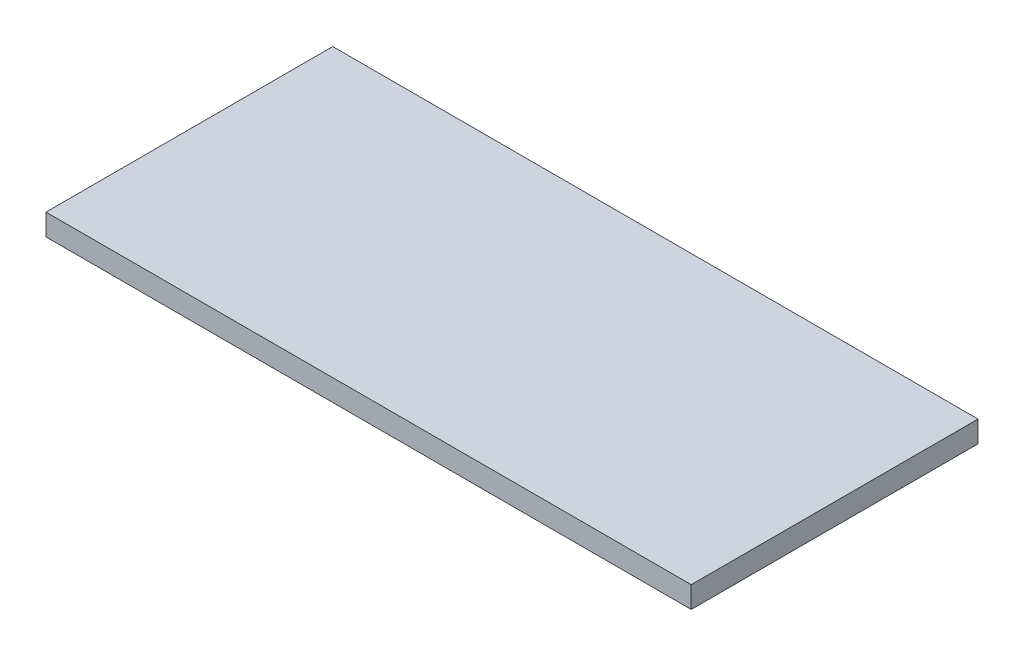
ISO-10303-21;
HEADER;
FILE_DESCRIPTION(('STEP AP214'),'2;1');
FILE_NAME('part.step','',(''),(''),'','','');
FILE_SCHEMA(('AUTOMOTIVE_DESIGN { 1 0 10303 214 1 1 1 1 }'));
ENDSEC;
DATA;
#1=APPLICATION_CONTEXT('core data for automotive mechanical design processes');
#2=APPLICATION_PROTOCOL_DEFINITION('international standard','automotive_design',2000,#1);
#3=PRODUCT_CONTEXT('',#1,'mechanical');
#4=PRODUCT('Part','Part','',(#3));
#5=PRODUCT_RELATED_PRODUCT_CATEGORY('part','',(#4));
#6=PRODUCT_DEFINITION_FORMATION('','',#4);
#7=PRODUCT_DEFINITION_CONTEXT('part definition',#1,'design');
#8=PRODUCT_DEFINITION('design','',#6,#7);
#9=PRODUCT_DEFINITION_SHAPE('','',#8);
#10=(LENGTH_UNIT() NAMED_UNIT(*) SI_UNIT(.MILLI.,.METRE.));
#11=(NAMED_UNIT(*) PLANE_ANGLE_UNIT() SI_UNIT($,.RADIAN.));
#12=(NAMED_UNIT(*) SI_UNIT($,.STERADIAN.) SOLID_ANGLE_UNIT());
#13=UNCERTAINTY_MEASURE_WITH_UNIT(LENGTH_MEASURE(1.E-05),#10,'distance_accuracy_value','');
#14=(GEOMETRIC_REPRESENTATION_CONTEXT(3) GLOBAL_UNCERTAINTY_ASSIGNED_CONTEXT((#13)) GLOBAL_UNIT_ASSIGNED_CONTEXT((#10,
#11,#12)) REPRESENTATION_CONTEXT('',''));
#15=CARTESIAN_POINT('',(0.,0.,0.));
#16=DIRECTION('',(0.,0.,1.));
#17=DIRECTION('',(1.,0.,0.));
#18=AXIS2_PLACEMENT_3D('',#15,#16,#17);
#19=CARTESIAN_POINT('',(225.,15.,100.));
#20=DIRECTION('',(-1.,0.,0.));
#21=DIRECTION('',(0.,0.,1.));
#22=AXIS2_PLACEMENT_3D('',#19,#20,#21);
#23=PLANE('',#22);
#24=DIRECTION('',(0.,0.,-1.));
#25=VECTOR('',#24,1.);
#26=CARTESIAN_POINT('',(225.,0.,100.));
#27=LINE('',#26,#25);
#28=CARTESIAN_POINT('',(225.,0.,100.));
#29=VERTEX_POINT('',#28);
#30=CARTESIAN_POINT('',(225.,0.,-100.));
#31=VERTEX_POINT('',#30);
#32=EDGE_CURVE('E96',#29,#31,#27,.T.);
#33=ORIENTED_EDGE('',*,*,#32,.T.);
#34=DIRECTION('',(0.,-1.,0.));
#35=VECTOR('',#34,1.);
#36=CARTESIAN_POINT('',(225.,15.,-100.));
#37=LINE('',#36,#35);
#38=CARTESIAN_POINT('',(225.,15.,-100.));
#39=VERTEX_POINT('',#38);
#40=EDGE_CURVE('E11',#39,#31,#37,.T.);
#41=ORIENTED_EDGE('',*,*,#40,.F.);
#42=DIRECTION('',(0.,0.,-1.));
#43=VECTOR('',#42,1.);
#44=CARTESIAN_POINT('',(225.,15.,100.));
#45=LINE('',#44,#43);
#46=CARTESIAN_POINT('',(225.,15.,100.));
#47=VERTEX_POINT('',#46);
#48=EDGE_CURVE('E84',#47,#39,#45,.T.);
#49=ORIENTED_EDGE('',*,*,#48,.F.);
#50=DIRECTION('',(0.,-1.,0.));
#51=VECTOR('',#50,1.);
#52=CARTESIAN_POINT('',(225.,15.,100.));
#53=LINE('',#52,#51);
#54=EDGE_CURVE('E92',#47,#29,#53,.T.);
#55=ORIENTED_EDGE('',*,*,#54,.T.);
#56=EDGE_LOOP('',(#33,#41,#49,#55));
#57=FACE_BOUND('',#56,.T.);
#58=ADVANCED_FACE('F33',(#57),#23,.F.);
#59=CARTESIAN_POINT('',(-225.,15.,-100.));
#60=DIRECTION('',(0.,0.,1.));
#61=DIRECTION('',(1.,0.,0.));
#62=AXIS2_PLACEMENT_3D('',#59,#60,#61);
#63=PLANE('',#62);
#64=DIRECTION('',(-1.,0.,0.));
#65=VECTOR('',#64,1.);
#66=CARTESIAN_POINT('',(-225.,0.,-100.));
#67=LINE('',#66,#65);
#68=CARTESIAN_POINT('',(-225.,0.,-100.));
#69=VERTEX_POINT('',#68);
#70=EDGE_CURVE('E88',#31,#69,#67,.T.);
#71=ORIENTED_EDGE('',*,*,#70,.T.);
#72=DIRECTION('',(0.,-1.,0.));
#73=VECTOR('',#72,1.);
#74=CARTESIAN_POINT('',(-225.,15.,-100.));
#75=LINE('',#74,#73);
#76=CARTESIAN_POINT('',(-225.,15.,-100.));
#77=VERTEX_POINT('',#76);
#78=EDGE_CURVE('E41',#77,#69,#75,.T.);
#79=ORIENTED_EDGE('',*,*,#78,.F.);
#80=DIRECTION('',(-1.,0.,0.));
#81=VECTOR('',#80,1.);
#82=CARTESIAN_POINT('',(-225.,15.,-100.));
#83=LINE('',#82,#81);
#84=EDGE_CURVE('E79',#39,#77,#83,.T.);
#85=ORIENTED_EDGE('',*,*,#84,.F.);
#86=ORIENTED_EDGE('',*,*,#40,.T.);
#87=EDGE_LOOP('',(#71,#79,#85,#86));
#88=FACE_BOUND('',#87,.T.);
#89=ADVANCED_FACE('F87',(#88),#63,.F.);
#90=CARTESIAN_POINT('',(-225.,15.,100.));
#91=DIRECTION('',(1.,0.,0.));
#92=DIRECTION('',(0.,0.,-1.));
#93=AXIS2_PLACEMENT_3D('',#90,#91,#92);
#94=PLANE('',#93);
#95=DIRECTION('',(0.,0.,1.));
#96=VECTOR('',#95,1.);
#97=CARTESIAN_POINT('',(-225.,0.,100.));
#98=LINE('',#97,#96);
#99=CARTESIAN_POINT('',(-225.,0.,100.));
#100=VERTEX_POINT('',#99);
#101=EDGE_CURVE('E66',#69,#100,#98,.T.);
#102=ORIENTED_EDGE('',*,*,#101,.T.);
#103=DIRECTION('',(0.,-1.,0.));
#104=VECTOR('',#103,1.);
#105=CARTESIAN_POINT('',(-225.,15.,100.));
#106=LINE('',#105,#104);
#107=CARTESIAN_POINT('',(-225.,15.,100.));
#108=VERTEX_POINT('',#107);
#109=EDGE_CURVE('E89',#108,#100,#106,.T.);
#110=ORIENTED_EDGE('',*,*,#109,.F.);
#111=DIRECTION('',(0.,0.,1.));
#112=VECTOR('',#111,1.);
#113=CARTESIAN_POINT('',(-225.,15.,100.));
#114=LINE('',#113,#112);
#115=EDGE_CURVE('E82',#77,#108,#114,.T.);
#116=ORIENTED_EDGE('',*,*,#115,.F.);
#117=ORIENTED_EDGE('',*,*,#78,.T.);
#118=EDGE_LOOP('',(#102,#110,#116,#117));
#119=FACE_BOUND('',#118,.T.);
#120=ADVANCED_FACE('F90',(#119),#94,.F.);
#121=CARTESIAN_POINT('',(-225.,15.,100.));
#122=DIRECTION('',(0.,0.,-1.));
#123=DIRECTION('',(-1.,0.,0.));
#124=AXIS2_PLACEMENT_3D('',#121,#122,#123);
#125=PLANE('',#124);
#126=DIRECTION('',(1.,0.,0.));
#127=VECTOR('',#126,1.);
#128=CARTESIAN_POINT('',(-225.,0.,100.));
#129=LINE('',#128,#127);
#130=EDGE_CURVE('E72',#100,#29,#129,.T.);
#131=ORIENTED_EDGE('',*,*,#130,.T.);
#132=ORIENTED_EDGE('',*,*,#54,.F.);
#133=DIRECTION('',(1.,0.,0.));
#134=VECTOR('',#133,1.);
#135=CARTESIAN_POINT('',(-225.,15.,100.));
#136=LINE('',#135,#134);
#137=EDGE_CURVE('E49',#108,#47,#136,.T.);
#138=ORIENTED_EDGE('',*,*,#137,.F.);
#139=ORIENTED_EDGE('',*,*,#109,.T.);
#140=EDGE_LOOP('',(#131,#132,#138,#139));
#141=FACE_BOUND('',#140,.T.);
#142=ADVANCED_FACE('F103',(#141),#125,.F.);
#143=CARTESIAN_POINT('',(0.,15.,0.));
#144=DIRECTION('',(0.,-1.,0.));
#145=DIRECTION('',(0.,0.,-1.));
#146=AXIS2_PLACEMENT_3D('',#143,#144,#145);
#147=PLANE('',#146);
#148=ORIENTED_EDGE('',*,*,#48,.T.);
#149=ORIENTED_EDGE('',*,*,#84,.T.);
#150=ORIENTED_EDGE('',*,*,#115,.T.);
#151=ORIENTED_EDGE('',*,*,#137,.T.);
#152=EDGE_LOOP('',(#148,#149,#150,#151));
#153=FACE_BOUND('',#152,.T.);
#154=ADVANCED_FACE('F80',(#153),#147,.F.);
#155=CARTESIAN_POINT('',(0.,0.,0.));
#156=DIRECTION('',(0.,-1.,0.));
#157=DIRECTION('',(0.,0.,-1.));
#158=AXIS2_PLACEMENT_3D('',#155,#156,#157);
#159=PLANE('',#158);
#160=ORIENTED_EDGE('',*,*,#32,.F.);
#161=ORIENTED_EDGE('',*,*,#130,.F.);
#162=ORIENTED_EDGE('',*,*,#101,.F.);
#163=ORIENTED_EDGE('',*,*,#70,.F.);
#164=EDGE_LOOP('',(#160,#161,#162,#163));
#165=FACE_BOUND('',#164,.T.);
#166=ADVANCED_FACE('F106',(#165),#159,.T.);
#167=CLOSED_SHELL('',(#58,#89,#120,#142,#154,#166));
#168=MANIFOLD_SOLID_BREP('B2',#167);
#169=ADVANCED_BREP_SHAPE_REPRESENTATION('',(#18,#168),#14);
#170=SHAPE_DEFINITION_REPRESENTATION(#9,#169);
ENDSEC;
END-ISO-10303-21;
